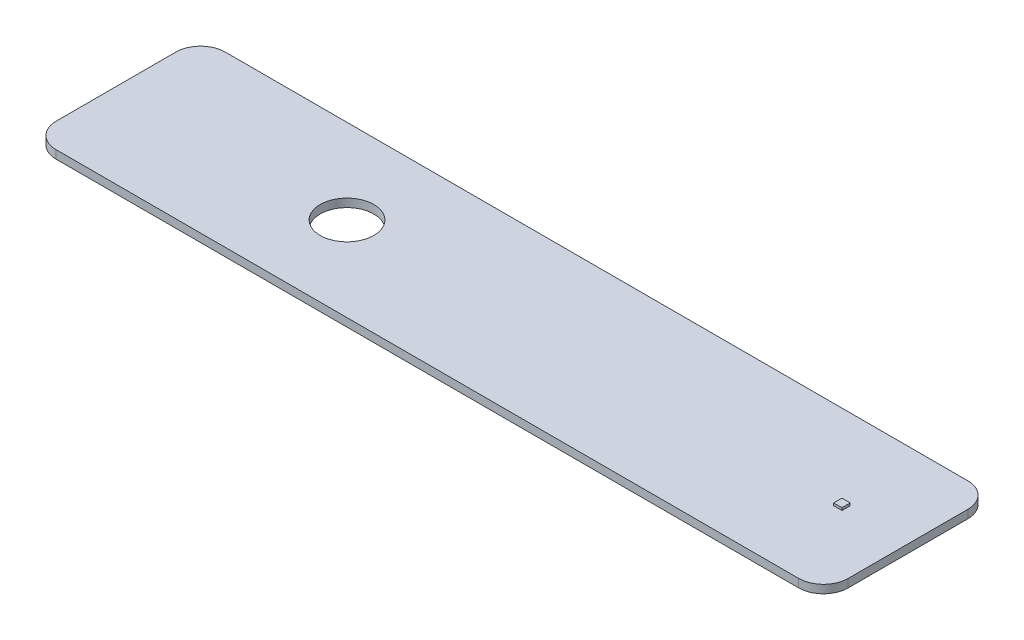
ISO-10303-21;
HEADER;
FILE_DESCRIPTION(('STEP AP214'),'2;1');
FILE_NAME('part.step','',(''),(''),'','','');
FILE_SCHEMA(('AUTOMOTIVE_DESIGN { 1 0 10303 214 1 1 1 1 }'));
ENDSEC;
DATA;
#1=APPLICATION_CONTEXT('core data for automotive mechanical design processes');
#2=APPLICATION_PROTOCOL_DEFINITION('international standard','automotive_design',2000,#1);
#3=PRODUCT_CONTEXT('',#1,'mechanical');
#4=PRODUCT('Part','Part','',(#3));
#5=PRODUCT_RELATED_PRODUCT_CATEGORY('part','',(#4));
#6=PRODUCT_DEFINITION_FORMATION('','',#4);
#7=PRODUCT_DEFINITION_CONTEXT('part definition',#1,'design');
#8=PRODUCT_DEFINITION('design','',#6,#7);
#9=PRODUCT_DEFINITION_SHAPE('','',#8);
#10=(LENGTH_UNIT() NAMED_UNIT(*) SI_UNIT(.MILLI.,.METRE.));
#11=(NAMED_UNIT(*) PLANE_ANGLE_UNIT() SI_UNIT($,.RADIAN.));
#12=(NAMED_UNIT(*) SI_UNIT($,.STERADIAN.) SOLID_ANGLE_UNIT());
#13=UNCERTAINTY_MEASURE_WITH_UNIT(LENGTH_MEASURE(1.E-05),#10,'distance_accuracy_value','');
#14=(GEOMETRIC_REPRESENTATION_CONTEXT(3) GLOBAL_UNCERTAINTY_ASSIGNED_CONTEXT((#13)) GLOBAL_UNIT_ASSIGNED_CONTEXT((#10,
#11,#12)) REPRESENTATION_CONTEXT('',''));
#15=CARTESIAN_POINT('',(0.,0.,0.));
#16=DIRECTION('',(0.,0.,1.));
#17=DIRECTION('',(1.,0.,0.));
#18=AXIS2_PLACEMENT_3D('',#15,#16,#17);
#19=CARTESIAN_POINT('',(-45.,1.,7.25));
#20=DIRECTION('',(0.,1.,0.));
#21=DIRECTION('',(0.,0.,1.));
#22=AXIS2_PLACEMENT_3D('',#19,#20,#21);
#23=PLANE('',#22);
#24=CARTESIAN_POINT('',(-20.,1.,0.));
#25=DIRECTION('',(0.,1.,0.));
#26=DIRECTION('',(0.,0.,1.));
#27=AXIS2_PLACEMENT_3D('',#24,#25,#26);
#28=CIRCLE('',#27,3.25);
#29=CARTESIAN_POINT('',(-20.,1.,3.25));
#30=VERTEX_POINT('',#29);
#31=EDGE_CURVE('E421',#30,#30,#28,.T.);
#32=ORIENTED_EDGE('',*,*,#31,.F.);
#33=EDGE_LOOP('',(#32));
#34=FACE_BOUND('',#33,.T.);
#35=CARTESIAN_POINT('',(-45.,1.,7.25));
#36=DIRECTION('',(0.,1.,0.));
#37=DIRECTION('',(0.,0.,1.));
#38=AXIS2_PLACEMENT_3D('',#35,#36,#37);
#39=CIRCLE('',#38,3.);
#40=CARTESIAN_POINT('',(-48.,1.,7.25));
#41=VERTEX_POINT('',#40);
#42=CARTESIAN_POINT('',(-45.,1.,10.25));
#43=VERTEX_POINT('',#42);
#44=EDGE_CURVE('E161',#41,#43,#39,.T.);
#45=ORIENTED_EDGE('',*,*,#44,.T.);
#46=DIRECTION('',(1.,0.,0.));
#47=VECTOR('',#46,1.);
#48=CARTESIAN_POINT('',(-45.,1.,10.25));
#49=LINE('',#48,#47);
#50=CARTESIAN_POINT('',(45.,1.,10.25));
#51=VERTEX_POINT('',#50);
#52=EDGE_CURVE('E164',#43,#51,#49,.T.);
#53=ORIENTED_EDGE('',*,*,#52,.T.);
#54=CARTESIAN_POINT('',(45.,1.,7.25));
#55=DIRECTION('',(0.,1.,0.));
#56=DIRECTION('',(0.,0.,1.));
#57=AXIS2_PLACEMENT_3D('',#54,#55,#56);
#58=CIRCLE('',#57,3.);
#59=CARTESIAN_POINT('',(48.,1.,7.25));
#60=VERTEX_POINT('',#59);
#61=EDGE_CURVE('E167',#51,#60,#58,.T.);
#62=ORIENTED_EDGE('',*,*,#61,.T.);
#63=DIRECTION('',(0.,0.,1.));
#64=VECTOR('',#63,1.);
#65=CARTESIAN_POINT('',(48.,1.,-7.25));
#66=LINE('',#65,#64);
#67=CARTESIAN_POINT('',(48.,1.,-7.25));
#68=VERTEX_POINT('',#67);
#69=EDGE_CURVE('E169',#68,#60,#66,.T.);
#70=ORIENTED_EDGE('',*,*,#69,.F.);
#71=CARTESIAN_POINT('',(45.,1.,-7.25));
#72=DIRECTION('',(0.,-1.,0.));
#73=DIRECTION('',(0.,0.,-1.));
#74=AXIS2_PLACEMENT_3D('',#71,#72,#73);
#75=CIRCLE('',#74,3.);
#76=CARTESIAN_POINT('',(45.,1.,-10.25));
#77=VERTEX_POINT('',#76);
#78=EDGE_CURVE('E172',#77,#68,#75,.T.);
#79=ORIENTED_EDGE('',*,*,#78,.F.);
#80=DIRECTION('',(1.,0.,0.));
#81=VECTOR('',#80,1.);
#82=CARTESIAN_POINT('',(-45.,1.,-10.25));
#83=LINE('',#82,#81);
#84=CARTESIAN_POINT('',(-45.,1.,-10.25));
#85=VERTEX_POINT('',#84);
#86=EDGE_CURVE('E175',#85,#77,#83,.T.);
#87=ORIENTED_EDGE('',*,*,#86,.F.);
#88=CARTESIAN_POINT('',(-45.,1.,-7.25));
#89=DIRECTION('',(0.,1.,0.));
#90=DIRECTION('',(0.,0.,1.));
#91=AXIS2_PLACEMENT_3D('',#88,#89,#90);
#92=CIRCLE('',#91,3.);
#93=CARTESIAN_POINT('',(-48.,1.,-7.25));
#94=VERTEX_POINT('',#93);
#95=EDGE_CURVE('E178',#85,#94,#92,.T.);
#96=ORIENTED_EDGE('',*,*,#95,.T.);
#97=DIRECTION('',(0.,0.,1.));
#98=VECTOR('',#97,1.);
#99=CARTESIAN_POINT('',(-48.,1.,-7.25));
#100=LINE('',#99,#98);
#101=EDGE_CURVE('E180',#94,#41,#100,.T.);
#102=ORIENTED_EDGE('',*,*,#101,.T.);
#103=EDGE_LOOP('',(#45,#53,#62,#70,#79,#87,#96,#102));
#104=FACE_BOUND('',#103,.T.);
#105=DIRECTION('',(1.,0.,0.));
#106=VECTOR('',#105,1.);
#107=CARTESIAN_POINT('',(39.5,1.,0.5));
#108=LINE('',#107,#106);
#109=CARTESIAN_POINT('',(39.4999999999999,1.,0.5));
#110=VERTEX_POINT('',#109);
#111=CARTESIAN_POINT('',(40.4999999999999,1.,0.5));
#112=VERTEX_POINT('',#111);
#113=EDGE_CURVE('E56',#110,#112,#108,.T.);
#114=ORIENTED_EDGE('',*,*,#113,.F.);
#115=DIRECTION('',(0.,0.,1.));
#116=VECTOR('',#115,1.);
#117=CARTESIAN_POINT('',(39.5,1.,-0.5));
#118=LINE('',#117,#116);
#119=CARTESIAN_POINT('',(39.5,1.,-0.5));
#120=VERTEX_POINT('',#119);
#121=EDGE_CURVE('E151',#120,#110,#118,.T.);
#122=ORIENTED_EDGE('',*,*,#121,.F.);
#123=DIRECTION('',(1.,0.,0.));
#124=VECTOR('',#123,1.);
#125=CARTESIAN_POINT('',(39.5,1.,-0.5));
#126=LINE('',#125,#124);
#127=CARTESIAN_POINT('',(40.4999999999999,1.,-0.5));
#128=VERTEX_POINT('',#127);
#129=EDGE_CURVE('E148',#120,#128,#126,.T.);
#130=ORIENTED_EDGE('',*,*,#129,.T.);
#131=DIRECTION('',(0.,0.,1.));
#132=VECTOR('',#131,1.);
#133=CARTESIAN_POINT('',(40.5,1.,-0.5));
#134=LINE('',#133,#132);
#135=EDGE_CURVE('E61',#128,#112,#134,.T.);
#136=ORIENTED_EDGE('',*,*,#135,.T.);
#137=EDGE_LOOP('',(#114,#122,#130,#136));
#138=FACE_BOUND('',#137,.T.);
#139=ADVANCED_FACE('F41',(#34,#104,#138),#23,.T.);
#140=CARTESIAN_POINT('',(-45.,1.,7.25));
#141=DIRECTION('',(0.,-1.,0.));
#142=DIRECTION('',(0.,0.,-1.));
#143=AXIS2_PLACEMENT_3D('',#140,#141,#142);
#144=CYLINDRICAL_SURFACE('',#143,3.);
#145=CARTESIAN_POINT('',(-45.,0.,7.25));
#146=DIRECTION('',(0.,1.,0.));
#147=DIRECTION('',(0.,0.,1.));
#148=AXIS2_PLACEMENT_3D('',#145,#146,#147);
#149=CIRCLE('',#148,3.);
#150=CARTESIAN_POINT('',(-48.,0.,7.25));
#151=VERTEX_POINT('',#150);
#152=CARTESIAN_POINT('',(-45.,0.,10.25));
#153=VERTEX_POINT('',#152);
#154=EDGE_CURVE('E152',#151,#153,#149,.T.);
#155=ORIENTED_EDGE('',*,*,#154,.T.);
#156=DIRECTION('',(0.,-1.,0.));
#157=VECTOR('',#156,1.);
#158=CARTESIAN_POINT('',(-45.,1.,10.25));
#159=LINE('',#158,#157);
#160=EDGE_CURVE('E11',#43,#153,#159,.T.);
#161=ORIENTED_EDGE('',*,*,#160,.F.);
#162=ORIENTED_EDGE('',*,*,#44,.F.);
#163=DIRECTION('',(0.,-1.,0.));
#164=VECTOR('',#163,1.);
#165=CARTESIAN_POINT('',(-48.,1.,7.25));
#166=LINE('',#165,#164);
#167=EDGE_CURVE('E181',#41,#151,#166,.T.);
#168=ORIENTED_EDGE('',*,*,#167,.T.);
#169=EDGE_LOOP('',(#155,#161,#162,#168));
#170=FACE_BOUND('',#169,.T.);
#171=ADVANCED_FACE('F43',(#170),#144,.T.);
#172=CARTESIAN_POINT('',(-45.,1.,10.25));
#173=DIRECTION('',(0.,0.,-1.));
#174=DIRECTION('',(-1.,0.,0.));
#175=AXIS2_PLACEMENT_3D('',#172,#173,#174);
#176=PLANE('',#175);
#177=DIRECTION('',(1.,0.,0.));
#178=VECTOR('',#177,1.);
#179=CARTESIAN_POINT('',(-45.,0.,10.25));
#180=LINE('',#179,#178);
#181=CARTESIAN_POINT('',(45.,0.,10.25));
#182=VERTEX_POINT('',#181);
#183=EDGE_CURVE('E155',#153,#182,#180,.T.);
#184=ORIENTED_EDGE('',*,*,#183,.T.);
#185=DIRECTION('',(0.,-1.,0.));
#186=VECTOR('',#185,1.);
#187=CARTESIAN_POINT('',(45.,1.,10.25));
#188=LINE('',#187,#186);
#189=EDGE_CURVE('E49',#51,#182,#188,.T.);
#190=ORIENTED_EDGE('',*,*,#189,.F.);
#191=ORIENTED_EDGE('',*,*,#52,.F.);
#192=ORIENTED_EDGE('',*,*,#160,.T.);
#193=EDGE_LOOP('',(#184,#190,#191,#192));
#194=FACE_BOUND('',#193,.T.);
#195=ADVANCED_FACE('F248',(#194),#176,.F.);
#196=CARTESIAN_POINT('',(45.,1.,7.25));
#197=DIRECTION('',(0.,-1.,0.));
#198=DIRECTION('',(0.,0.,-1.));
#199=AXIS2_PLACEMENT_3D('',#196,#197,#198);
#200=CYLINDRICAL_SURFACE('',#199,3.);
#201=CARTESIAN_POINT('',(45.,0.,7.25));
#202=DIRECTION('',(0.,1.,0.));
#203=DIRECTION('',(0.,0.,1.));
#204=AXIS2_PLACEMENT_3D('',#201,#202,#203);
#205=CIRCLE('',#204,3.);
#206=CARTESIAN_POINT('',(48.,0.,7.25));
#207=VERTEX_POINT('',#206);
#208=EDGE_CURVE('E184',#182,#207,#205,.T.);
#209=ORIENTED_EDGE('',*,*,#208,.T.);
#210=DIRECTION('',(0.,-1.,0.));
#211=VECTOR('',#210,1.);
#212=CARTESIAN_POINT('',(48.,1.,7.25));
#213=LINE('',#212,#211);
#214=EDGE_CURVE('E210',#60,#207,#213,.T.);
#215=ORIENTED_EDGE('',*,*,#214,.F.);
#216=ORIENTED_EDGE('',*,*,#61,.F.);
#217=ORIENTED_EDGE('',*,*,#189,.T.);
#218=EDGE_LOOP('',(#209,#215,#216,#217));
#219=FACE_BOUND('',#218,.T.);
#220=ADVANCED_FACE('F216',(#219),#200,.T.);
#221=CARTESIAN_POINT('',(48.,1.,-7.25));
#222=DIRECTION('',(1.,0.,0.));
#223=DIRECTION('',(0.,0.,-1.));
#224=AXIS2_PLACEMENT_3D('',#221,#222,#223);
#225=PLANE('',#224);
#226=DIRECTION('',(0.,0.,1.));
#227=VECTOR('',#226,1.);
#228=CARTESIAN_POINT('',(48.,0.,-7.25));
#229=LINE('',#228,#227);
#230=CARTESIAN_POINT('',(48.,0.,-7.25));
#231=VERTEX_POINT('',#230);
#232=EDGE_CURVE('E187',#231,#207,#229,.T.);
#233=ORIENTED_EDGE('',*,*,#232,.F.);
#234=DIRECTION('',(0.,-1.,0.));
#235=VECTOR('',#234,1.);
#236=CARTESIAN_POINT('',(48.,1.,-7.25));
#237=LINE('',#236,#235);
#238=EDGE_CURVE('E208',#68,#231,#237,.T.);
#239=ORIENTED_EDGE('',*,*,#238,.F.);
#240=ORIENTED_EDGE('',*,*,#69,.T.);
#241=ORIENTED_EDGE('',*,*,#214,.T.);
#242=EDGE_LOOP('',(#233,#239,#240,#241));
#243=FACE_BOUND('',#242,.T.);
#244=ADVANCED_FACE('F225',(#243),#225,.T.);
#245=CARTESIAN_POINT('',(45.,1.,-7.25));
#246=DIRECTION('',(0.,-1.,0.));
#247=DIRECTION('',(0.,0.,-1.));
#248=AXIS2_PLACEMENT_3D('',#245,#246,#247);
#249=CYLINDRICAL_SURFACE('',#248,3.);
#250=CARTESIAN_POINT('',(45.,0.,-7.25));
#251=DIRECTION('',(0.,-1.,0.));
#252=DIRECTION('',(0.,0.,-1.));
#253=AXIS2_PLACEMENT_3D('',#250,#251,#252);
#254=CIRCLE('',#253,3.);
#255=CARTESIAN_POINT('',(45.,0.,-10.25));
#256=VERTEX_POINT('',#255);
#257=EDGE_CURVE('E190',#256,#231,#254,.T.);
#258=ORIENTED_EDGE('',*,*,#257,.F.);
#259=DIRECTION('',(0.,-1.,0.));
#260=VECTOR('',#259,1.);
#261=CARTESIAN_POINT('',(45.,1.,-10.25));
#262=LINE('',#261,#260);
#263=EDGE_CURVE('E206',#77,#256,#262,.T.);
#264=ORIENTED_EDGE('',*,*,#263,.F.);
#265=ORIENTED_EDGE('',*,*,#78,.T.);
#266=ORIENTED_EDGE('',*,*,#238,.T.);
#267=EDGE_LOOP('',(#258,#264,#265,#266));
#268=FACE_BOUND('',#267,.T.);
#269=ADVANCED_FACE('F231',(#268),#249,.T.);
#270=CARTESIAN_POINT('',(-45.,1.,-10.25));
#271=DIRECTION('',(0.,0.,-1.));
#272=DIRECTION('',(-1.,0.,0.));
#273=AXIS2_PLACEMENT_3D('',#270,#271,#272);
#274=PLANE('',#273);
#275=DIRECTION('',(1.,0.,0.));
#276=VECTOR('',#275,1.);
#277=CARTESIAN_POINT('',(-45.,0.,-10.25));
#278=LINE('',#277,#276);
#279=CARTESIAN_POINT('',(-45.,0.,-10.25));
#280=VERTEX_POINT('',#279);
#281=EDGE_CURVE('E193',#280,#256,#278,.T.);
#282=ORIENTED_EDGE('',*,*,#281,.F.);
#283=DIRECTION('',(0.,-1.,0.));
#284=VECTOR('',#283,1.);
#285=CARTESIAN_POINT('',(-45.,1.,-10.25));
#286=LINE('',#285,#284);
#287=EDGE_CURVE('E204',#85,#280,#286,.T.);
#288=ORIENTED_EDGE('',*,*,#287,.F.);
#289=ORIENTED_EDGE('',*,*,#86,.T.);
#290=ORIENTED_EDGE('',*,*,#263,.T.);
#291=EDGE_LOOP('',(#282,#288,#289,#290));
#292=FACE_BOUND('',#291,.T.);
#293=ADVANCED_FACE('F234',(#292),#274,.T.);
#294=CARTESIAN_POINT('',(-45.,1.,-7.25));
#295=DIRECTION('',(0.,-1.,0.));
#296=DIRECTION('',(0.,0.,-1.));
#297=AXIS2_PLACEMENT_3D('',#294,#295,#296);
#298=CYLINDRICAL_SURFACE('',#297,3.);
#299=CARTESIAN_POINT('',(-45.,0.,-7.25));
#300=DIRECTION('',(0.,1.,0.));
#301=DIRECTION('',(0.,0.,1.));
#302=AXIS2_PLACEMENT_3D('',#299,#300,#301);
#303=CIRCLE('',#302,3.);
#304=CARTESIAN_POINT('',(-48.,0.,-7.25));
#305=VERTEX_POINT('',#304);
#306=EDGE_CURVE('E196',#280,#305,#303,.T.);
#307=ORIENTED_EDGE('',*,*,#306,.T.);
#308=DIRECTION('',(0.,-1.,0.));
#309=VECTOR('',#308,1.);
#310=CARTESIAN_POINT('',(-48.,1.,-7.25));
#311=LINE('',#310,#309);
#312=EDGE_CURVE('E201',#94,#305,#311,.T.);
#313=ORIENTED_EDGE('',*,*,#312,.F.);
#314=ORIENTED_EDGE('',*,*,#95,.F.);
#315=ORIENTED_EDGE('',*,*,#287,.T.);
#316=EDGE_LOOP('',(#307,#313,#314,#315));
#317=FACE_BOUND('',#316,.T.);
#318=ADVANCED_FACE('F240',(#317),#298,.T.);
#319=CARTESIAN_POINT('',(-48.,1.,-7.25));
#320=DIRECTION('',(1.,0.,0.));
#321=DIRECTION('',(0.,0.,-1.));
#322=AXIS2_PLACEMENT_3D('',#319,#320,#321);
#323=PLANE('',#322);
#324=DIRECTION('',(0.,0.,1.));
#325=VECTOR('',#324,1.);
#326=CARTESIAN_POINT('',(-48.,0.,-7.25));
#327=LINE('',#326,#325);
#328=EDGE_CURVE('E165',#305,#151,#327,.T.);
#329=ORIENTED_EDGE('',*,*,#328,.T.);
#330=ORIENTED_EDGE('',*,*,#167,.F.);
#331=ORIENTED_EDGE('',*,*,#101,.F.);
#332=ORIENTED_EDGE('',*,*,#312,.T.);
#333=EDGE_LOOP('',(#329,#330,#331,#332));
#334=FACE_BOUND('',#333,.T.);
#335=ADVANCED_FACE('F244',(#334),#323,.F.);
#336=CARTESIAN_POINT('',(-45.,0.,7.25));
#337=DIRECTION('',(0.,1.,0.));
#338=DIRECTION('',(0.,0.,1.));
#339=AXIS2_PLACEMENT_3D('',#336,#337,#338);
#340=PLANE('',#339);
#341=CARTESIAN_POINT('',(-20.,0.,0.));
#342=DIRECTION('',(0.,1.,0.));
#343=DIRECTION('',(0.,0.,1.));
#344=AXIS2_PLACEMENT_3D('',#341,#342,#343);
#345=CIRCLE('',#344,3.25);
#346=CARTESIAN_POINT('',(-20.,0.,3.25));
#347=VERTEX_POINT('',#346);
#348=EDGE_CURVE('E419',#347,#347,#345,.T.);
#349=ORIENTED_EDGE('',*,*,#348,.T.);
#350=EDGE_LOOP('',(#349));
#351=FACE_BOUND('',#350,.T.);
#352=ORIENTED_EDGE('',*,*,#154,.F.);
#353=ORIENTED_EDGE('',*,*,#328,.F.);
#354=ORIENTED_EDGE('',*,*,#306,.F.);
#355=ORIENTED_EDGE('',*,*,#281,.T.);
#356=ORIENTED_EDGE('',*,*,#257,.T.);
#357=ORIENTED_EDGE('',*,*,#232,.T.);
#358=ORIENTED_EDGE('',*,*,#208,.F.);
#359=ORIENTED_EDGE('',*,*,#183,.F.);
#360=EDGE_LOOP('',(#352,#353,#354,#355,#356,#357,#358,#359));
#361=FACE_BOUND('',#360,.T.);
#362=ADVANCED_FACE('F221',(#351,#361),#340,.F.);
#363=CARTESIAN_POINT('',(39.5,1.3,-0.5));
#364=DIRECTION('',(1.,0.,0.));
#365=DIRECTION('',(0.,0.,-1.));
#366=AXIS2_PLACEMENT_3D('',#363,#364,#365);
#367=PLANE('',#366);
#368=ORIENTED_EDGE('',*,*,#121,.T.);
#369=DIRECTION('',(0.,-1.,0.));
#370=VECTOR('',#369,1.);
#371=CARTESIAN_POINT('',(39.5,1.3,0.5));
#372=LINE('',#371,#370);
#373=CARTESIAN_POINT('',(39.5,1.3,0.5));
#374=VERTEX_POINT('',#373);
#375=EDGE_CURVE('E132',#374,#110,#372,.T.);
#376=ORIENTED_EDGE('',*,*,#375,.F.);
#377=DIRECTION('',(0.,0.,1.));
#378=VECTOR('',#377,1.);
#379=CARTESIAN_POINT('',(39.5,1.3,-0.5));
#380=LINE('',#379,#378);
#381=CARTESIAN_POINT('',(39.5,1.3,-0.5));
#382=VERTEX_POINT('',#381);
#383=EDGE_CURVE('E139',#382,#374,#380,.T.);
#384=ORIENTED_EDGE('',*,*,#383,.F.);
#385=DIRECTION('',(0.,-1.,0.));
#386=VECTOR('',#385,1.);
#387=CARTESIAN_POINT('',(39.5,1.3,-0.5));
#388=LINE('',#387,#386);
#389=EDGE_CURVE('E427',#382,#120,#388,.T.);
#390=ORIENTED_EDGE('',*,*,#389,.T.);
#391=EDGE_LOOP('',(#368,#376,#384,#390));
#392=FACE_BOUND('',#391,.T.);
#393=ADVANCED_FACE('F150',(#392),#367,.F.);
#394=CARTESIAN_POINT('',(39.5,1.3,0.5));
#395=DIRECTION('',(0.,0.,-1.));
#396=DIRECTION('',(-1.,0.,0.));
#397=AXIS2_PLACEMENT_3D('',#394,#395,#396);
#398=PLANE('',#397);
#399=ORIENTED_EDGE('',*,*,#113,.T.);
#400=DIRECTION('',(0.,-1.,0.));
#401=VECTOR('',#400,1.);
#402=CARTESIAN_POINT('',(40.5,1.3,0.5));
#403=LINE('',#402,#401);
#404=CARTESIAN_POINT('',(40.5,1.3,0.5));
#405=VERTEX_POINT('',#404);
#406=EDGE_CURVE('E134',#405,#112,#403,.T.);
#407=ORIENTED_EDGE('',*,*,#406,.F.);
#408=DIRECTION('',(1.,0.,0.));
#409=VECTOR('',#408,1.);
#410=CARTESIAN_POINT('',(39.5,1.3,0.5));
#411=LINE('',#410,#409);
#412=EDGE_CURVE('E128',#374,#405,#411,.T.);
#413=ORIENTED_EDGE('',*,*,#412,.F.);
#414=ORIENTED_EDGE('',*,*,#375,.T.);
#415=EDGE_LOOP('',(#399,#407,#413,#414));
#416=FACE_BOUND('',#415,.T.);
#417=ADVANCED_FACE('F130',(#416),#398,.F.);
#418=CARTESIAN_POINT('',(40.5,1.3,-0.5));
#419=DIRECTION('',(1.,0.,0.));
#420=DIRECTION('',(0.,0.,-1.));
#421=AXIS2_PLACEMENT_3D('',#418,#419,#420);
#422=PLANE('',#421);
#423=ORIENTED_EDGE('',*,*,#135,.F.);
#424=DIRECTION('',(0.,-1.,0.));
#425=VECTOR('',#424,1.);
#426=CARTESIAN_POINT('',(40.5,1.3,-0.5));
#427=LINE('',#426,#425);
#428=CARTESIAN_POINT('',(40.5,1.3,-0.5));
#429=VERTEX_POINT('',#428);
#430=EDGE_CURVE('E157',#429,#128,#427,.T.);
#431=ORIENTED_EDGE('',*,*,#430,.F.);
#432=DIRECTION('',(0.,0.,1.));
#433=VECTOR('',#432,1.);
#434=CARTESIAN_POINT('',(40.5,1.3,-0.5));
#435=LINE('',#434,#433);
#436=EDGE_CURVE('E138',#429,#405,#435,.T.);
#437=ORIENTED_EDGE('',*,*,#436,.T.);
#438=ORIENTED_EDGE('',*,*,#406,.T.);
#439=EDGE_LOOP('',(#423,#431,#437,#438));
#440=FACE_BOUND('',#439,.T.);
#441=ADVANCED_FACE('F312',(#440),#422,.T.);
#442=CARTESIAN_POINT('',(39.5,1.3,-0.5));
#443=DIRECTION('',(0.,0.,-1.));
#444=DIRECTION('',(-1.,0.,0.));
#445=AXIS2_PLACEMENT_3D('',#442,#443,#444);
#446=PLANE('',#445);
#447=ORIENTED_EDGE('',*,*,#129,.F.);
#448=ORIENTED_EDGE('',*,*,#389,.F.);
#449=DIRECTION('',(1.,0.,0.));
#450=VECTOR('',#449,1.);
#451=CARTESIAN_POINT('',(39.5,1.3,-0.5));
#452=LINE('',#451,#450);
#453=EDGE_CURVE('E145',#382,#429,#452,.T.);
#454=ORIENTED_EDGE('',*,*,#453,.T.);
#455=ORIENTED_EDGE('',*,*,#430,.T.);
#456=EDGE_LOOP('',(#447,#448,#454,#455));
#457=FACE_BOUND('',#456,.T.);
#458=ADVANCED_FACE('F318',(#457),#446,.T.);
#459=CARTESIAN_POINT('',(0.,1.3,0.));
#460=DIRECTION('',(0.,1.,0.));
#461=DIRECTION('',(0.,0.,1.));
#462=AXIS2_PLACEMENT_3D('',#459,#460,#461);
#463=PLANE('',#462);
#464=ORIENTED_EDGE('',*,*,#383,.T.);
#465=ORIENTED_EDGE('',*,*,#412,.T.);
#466=ORIENTED_EDGE('',*,*,#436,.F.);
#467=ORIENTED_EDGE('',*,*,#453,.F.);
#468=EDGE_LOOP('',(#464,#465,#466,#467));
#469=FACE_BOUND('',#468,.T.);
#470=ADVANCED_FACE('F143',(#469),#463,.T.);
#471=CARTESIAN_POINT('',(-20.,0.,0.));
#472=DIRECTION('',(0.,1.,0.));
#473=DIRECTION('',(0.,0.,1.));
#474=AXIS2_PLACEMENT_3D('',#471,#472,#473);
#475=CYLINDRICAL_SURFACE('',#474,3.25);
#476=ORIENTED_EDGE('',*,*,#348,.F.);
#477=EDGE_LOOP('',(#476));
#478=FACE_BOUND('',#477,.T.);
#479=ORIENTED_EDGE('',*,*,#31,.T.);
#480=EDGE_LOOP('',(#479));
#481=FACE_BOUND('',#480,.T.);
#482=ADVANCED_FACE('F333',(#478,#481),#475,.F.);
#483=CLOSED_SHELL('',(#139,#171,#195,#220,#244,#269,#293,#318,#335,#362,#393,#417,#441,#458,
#470,#482));
#484=MANIFOLD_SOLID_BREP('B2',#483);
#485=ADVANCED_BREP_SHAPE_REPRESENTATION('',(#18,#484),#14);
#486=SHAPE_DEFINITION_REPRESENTATION(#9,#485);
ENDSEC;
END-ISO-10303-21;
